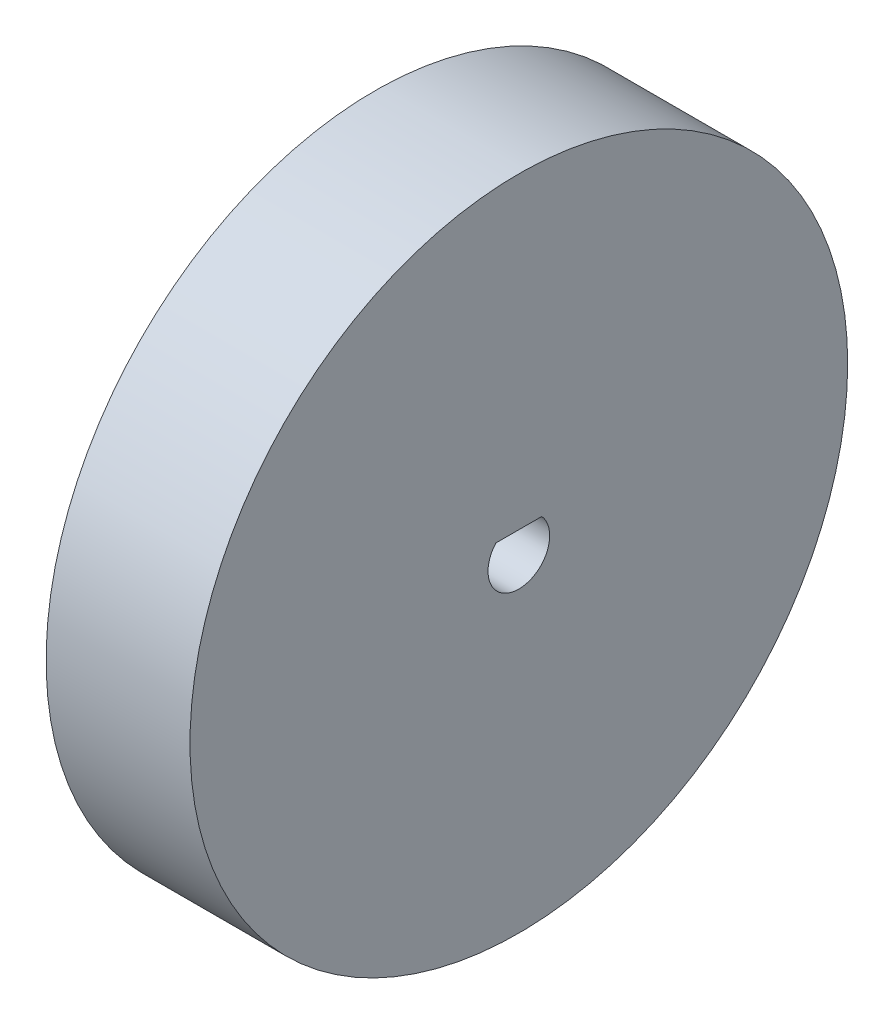
ISO-10303-21;
HEADER;
FILE_DESCRIPTION(('STEP AP214'),'2;1');
FILE_NAME('part.step','',(''),(''),'','','');
FILE_SCHEMA(('AUTOMOTIVE_DESIGN { 1 0 10303 214 1 1 1 1 }'));
ENDSEC;
DATA;
#1=APPLICATION_CONTEXT('core data for automotive mechanical design processes');
#2=APPLICATION_PROTOCOL_DEFINITION('international standard','automotive_design',2000,#1);
#3=PRODUCT_CONTEXT('',#1,'mechanical');
#4=PRODUCT('Part','Part','',(#3));
#5=PRODUCT_RELATED_PRODUCT_CATEGORY('part','',(#4));
#6=PRODUCT_DEFINITION_FORMATION('','',#4);
#7=PRODUCT_DEFINITION_CONTEXT('part definition',#1,'design');
#8=PRODUCT_DEFINITION('design','',#6,#7);
#9=PRODUCT_DEFINITION_SHAPE('','',#8);
#10=(LENGTH_UNIT() NAMED_UNIT(*) SI_UNIT(.MILLI.,.METRE.));
#11=(NAMED_UNIT(*) PLANE_ANGLE_UNIT() SI_UNIT($,.RADIAN.));
#12=(NAMED_UNIT(*) SI_UNIT($,.STERADIAN.) SOLID_ANGLE_UNIT());
#13=UNCERTAINTY_MEASURE_WITH_UNIT(LENGTH_MEASURE(1.E-05),#10,'distance_accuracy_value','');
#14=(GEOMETRIC_REPRESENTATION_CONTEXT(3) GLOBAL_UNCERTAINTY_ASSIGNED_CONTEXT((#13)) GLOBAL_UNIT_ASSIGNED_CONTEXT((#10,
#11,#12)) REPRESENTATION_CONTEXT('',''));
#15=CARTESIAN_POINT('',(0.,0.,0.));
#16=DIRECTION('',(0.,0.,1.));
#17=DIRECTION('',(1.,0.,0.));
#18=AXIS2_PLACEMENT_3D('',#15,#16,#17);
#19=CARTESIAN_POINT('',(7.,0.,0.));
#20=DIRECTION('',(1.,0.,0.));
#21=DIRECTION('',(0.,0.,-1.));
#22=AXIS2_PLACEMENT_3D('',#19,#20,#21);
#23=PLANE('',#22);
#24=CARTESIAN_POINT('',(7.,0.,0.));
#25=DIRECTION('',(1.,0.,0.));
#26=DIRECTION('',(0.,0.,-1.));
#27=AXIS2_PLACEMENT_3D('',#24,#25,#26);
#28=CIRCLE('',#27,16.);
#29=CARTESIAN_POINT('',(7.,0.,-16.));
#30=VERTEX_POINT('',#29);
#31=EDGE_CURVE('E11',#30,#30,#28,.T.);
#32=ORIENTED_EDGE('',*,*,#31,.T.);
#33=EDGE_LOOP('',(#32));
#34=FACE_BOUND('',#33,.T.);
#35=DIRECTION('',(0.,0.,1.));
#36=VECTOR('',#35,1.);
#37=CARTESIAN_POINT('',(7.,1.,1.11803398874989));
#38=LINE('',#37,#36);
#39=CARTESIAN_POINT('',(7.,1.,-1.11803398874989));
#40=VERTEX_POINT('',#39);
#41=CARTESIAN_POINT('',(7.,1.,1.11803398874989));
#42=VERTEX_POINT('',#41);
#43=EDGE_CURVE('E74',#40,#42,#38,.T.);
#44=ORIENTED_EDGE('',*,*,#43,.F.);
#45=CARTESIAN_POINT('',(7.,0.,0.));
#46=DIRECTION('',(1.,0.,0.));
#47=DIRECTION('',(0.,0.,-1.));
#48=AXIS2_PLACEMENT_3D('',#45,#46,#47);
#49=CIRCLE('',#48,1.5);
#50=EDGE_CURVE('E65',#42,#40,#49,.T.);
#51=ORIENTED_EDGE('',*,*,#50,.F.);
#52=EDGE_LOOP('',(#44,#51));
#53=FACE_BOUND('',#52,.T.);
#54=ADVANCED_FACE('F33',(#34,#53),#23,.T.);
#55=CARTESIAN_POINT('',(0.,0.,0.));
#56=DIRECTION('',(1.,0.,0.));
#57=DIRECTION('',(0.,0.,-1.));
#58=AXIS2_PLACEMENT_3D('',#55,#56,#57);
#59=PLANE('',#58);
#60=CARTESIAN_POINT('',(0.,0.,0.));
#61=DIRECTION('',(1.,0.,0.));
#62=DIRECTION('',(0.,0.,-1.));
#63=AXIS2_PLACEMENT_3D('',#60,#61,#62);
#64=CIRCLE('',#63,16.);
#65=CARTESIAN_POINT('',(0.,0.,-16.));
#66=VERTEX_POINT('',#65);
#67=EDGE_CURVE('E37',#66,#66,#64,.T.);
#68=ORIENTED_EDGE('',*,*,#67,.F.);
#69=EDGE_LOOP('',(#68));
#70=FACE_BOUND('',#69,.T.);
#71=CARTESIAN_POINT('',(0.,0.,0.));
#72=DIRECTION('',(1.,0.,0.));
#73=DIRECTION('',(0.,0.,-1.));
#74=AXIS2_PLACEMENT_3D('',#71,#72,#73);
#75=CIRCLE('',#74,1.5);
#76=CARTESIAN_POINT('',(0.,1.,1.11803398874989));
#77=VERTEX_POINT('',#76);
#78=CARTESIAN_POINT('',(0.,1.,-1.11803398874989));
#79=VERTEX_POINT('',#78);
#80=EDGE_CURVE('E55',#77,#79,#75,.T.);
#81=ORIENTED_EDGE('',*,*,#80,.T.);
#82=DIRECTION('',(0.,0.,1.));
#83=VECTOR('',#82,1.);
#84=CARTESIAN_POINT('',(0.,1.,1.11803398874989));
#85=LINE('',#84,#83);
#86=EDGE_CURVE('E61',#79,#77,#85,.T.);
#87=ORIENTED_EDGE('',*,*,#86,.T.);
#88=EDGE_LOOP('',(#81,#87));
#89=FACE_BOUND('',#88,.T.);
#90=ADVANCED_FACE('F71',(#70,#89),#59,.F.);
#91=CARTESIAN_POINT('',(7.,0.,0.));
#92=DIRECTION('',(-1.,0.,0.));
#93=DIRECTION('',(0.,0.,1.));
#94=AXIS2_PLACEMENT_3D('',#91,#92,#93);
#95=CYLINDRICAL_SURFACE('',#94,16.);
#96=ORIENTED_EDGE('',*,*,#31,.F.);
#97=EDGE_LOOP('',(#96));
#98=FACE_BOUND('',#97,.T.);
#99=ORIENTED_EDGE('',*,*,#67,.T.);
#100=EDGE_LOOP('',(#99));
#101=FACE_BOUND('',#100,.T.);
#102=ADVANCED_FACE('F35',(#98,#101),#95,.T.);
#103=CARTESIAN_POINT('',(7.,0.,0.));
#104=DIRECTION('',(-1.,0.,0.));
#105=DIRECTION('',(0.,0.,1.));
#106=AXIS2_PLACEMENT_3D('',#103,#104,#105);
#107=CYLINDRICAL_SURFACE('',#106,1.5);
#108=ORIENTED_EDGE('',*,*,#80,.F.);
#109=DIRECTION('',(-1.,0.,0.));
#110=VECTOR('',#109,1.);
#111=CARTESIAN_POINT('',(7.,1.,1.11803398874989));
#112=LINE('',#111,#110);
#113=EDGE_CURVE('E63',#42,#77,#112,.T.);
#114=ORIENTED_EDGE('',*,*,#113,.F.);
#115=ORIENTED_EDGE('',*,*,#50,.T.);
#116=DIRECTION('',(-1.,0.,0.));
#117=VECTOR('',#116,1.);
#118=CARTESIAN_POINT('',(7.,1.,-1.11803398874989));
#119=LINE('',#118,#117);
#120=EDGE_CURVE('E48',#40,#79,#119,.T.);
#121=ORIENTED_EDGE('',*,*,#120,.T.);
#122=EDGE_LOOP('',(#108,#114,#115,#121));
#123=FACE_BOUND('',#122,.T.);
#124=ADVANCED_FACE('F67',(#123),#107,.F.);
#125=CARTESIAN_POINT('',(7.,1.,1.11803398874989));
#126=DIRECTION('',(0.,-1.,0.));
#127=DIRECTION('',(0.,0.,-1.));
#128=AXIS2_PLACEMENT_3D('',#125,#126,#127);
#129=PLANE('',#128);
#130=ORIENTED_EDGE('',*,*,#86,.F.);
#131=ORIENTED_EDGE('',*,*,#120,.F.);
#132=ORIENTED_EDGE('',*,*,#43,.T.);
#133=ORIENTED_EDGE('',*,*,#113,.T.);
#134=EDGE_LOOP('',(#130,#131,#132,#133));
#135=FACE_BOUND('',#134,.T.);
#136=ADVANCED_FACE('F62',(#135),#129,.T.);
#137=CLOSED_SHELL('',(#54,#90,#102,#124,#136));
#138=MANIFOLD_SOLID_BREP('B2',#137);
#139=ADVANCED_BREP_SHAPE_REPRESENTATION('',(#18,#138),#14);
#140=SHAPE_DEFINITION_REPRESENTATION(#9,#139);
ENDSEC;
END-ISO-10303-21;
